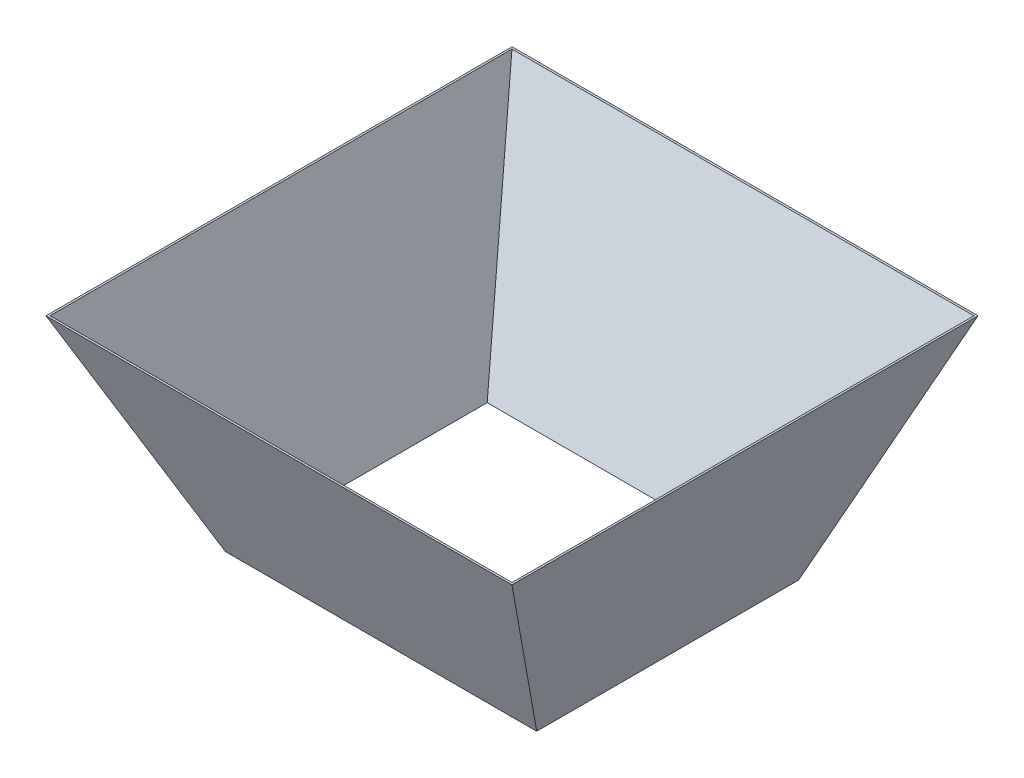
ISO-10303-21;
HEADER;
FILE_DESCRIPTION(('STEP AP214'),'2;1');
FILE_NAME('part.step','',(''),(''),'','','');
FILE_SCHEMA(('AUTOMOTIVE_DESIGN { 1 0 10303 214 1 1 1 1 }'));
ENDSEC;
DATA;
#1=APPLICATION_CONTEXT('core data for automotive mechanical design processes');
#2=APPLICATION_PROTOCOL_DEFINITION('international standard','automotive_design',2000,#1);
#3=PRODUCT_CONTEXT('',#1,'mechanical');
#4=PRODUCT('Part','Part','',(#3));
#5=PRODUCT_RELATED_PRODUCT_CATEGORY('part','',(#4));
#6=PRODUCT_DEFINITION_FORMATION('','',#4);
#7=PRODUCT_DEFINITION_CONTEXT('part definition',#1,'design');
#8=PRODUCT_DEFINITION('design','',#6,#7);
#9=PRODUCT_DEFINITION_SHAPE('','',#8);
#10=(LENGTH_UNIT() NAMED_UNIT(*) SI_UNIT(.MILLI.,.METRE.));
#11=(NAMED_UNIT(*) PLANE_ANGLE_UNIT() SI_UNIT($,.RADIAN.));
#12=(NAMED_UNIT(*) SI_UNIT($,.STERADIAN.) SOLID_ANGLE_UNIT());
#13=UNCERTAINTY_MEASURE_WITH_UNIT(LENGTH_MEASURE(1.E-05),#10,'distance_accuracy_value','');
#14=(GEOMETRIC_REPRESENTATION_CONTEXT(3) GLOBAL_UNCERTAINTY_ASSIGNED_CONTEXT((#13)) GLOBAL_UNIT_ASSIGNED_CONTEXT((#10,
#11,#12)) REPRESENTATION_CONTEXT('',''));
#15=CARTESIAN_POINT('',(0.,0.,0.));
#16=DIRECTION('',(0.,0.,1.));
#17=DIRECTION('',(1.,0.,0.));
#18=AXIS2_PLACEMENT_3D('',#15,#16,#17);
#19=CARTESIAN_POINT('',(0.,0.,0.));
#20=DIRECTION('',(0.,1.,0.));
#21=DIRECTION('',(0.,0.,1.));
#22=AXIS2_PLACEMENT_3D('',#19,#20,#21);
#23=PLANE('',#22);
#24=DIRECTION('',(0.,0.,-1.));
#25=VECTOR('',#24,1.);
#26=CARTESIAN_POINT('',(251.59279308007,0.,0.));
#27=LINE('',#26,#25);
#28=CARTESIAN_POINT('',(251.59279308007,0.,211.658327778338));
#29=VERTEX_POINT('',#28);
#30=CARTESIAN_POINT('',(251.59279308007,0.,-211.658327778338));
#31=VERTEX_POINT('',#30);
#32=EDGE_CURVE('E115',#29,#31,#27,.T.);
#33=ORIENTED_EDGE('',*,*,#32,.F.);
#34=DIRECTION('',(1.,0.,0.));
#35=VECTOR('',#34,1.);
#36=CARTESIAN_POINT('',(0.,0.,211.658327778338));
#37=LINE('',#36,#35);
#38=CARTESIAN_POINT('',(-251.59279308007,0.,211.658327778338));
#39=VERTEX_POINT('',#38);
#40=EDGE_CURVE('E106',#39,#29,#37,.T.);
#41=ORIENTED_EDGE('',*,*,#40,.F.);
#42=DIRECTION('',(0.,0.,1.));
#43=VECTOR('',#42,1.);
#44=CARTESIAN_POINT('',(-251.59279308007,0.,0.));
#45=LINE('',#44,#43);
#46=CARTESIAN_POINT('',(-251.59279308007,0.,-211.658327778338));
#47=VERTEX_POINT('',#46);
#48=EDGE_CURVE('E55',#47,#39,#45,.T.);
#49=ORIENTED_EDGE('',*,*,#48,.F.);
#50=DIRECTION('',(-1.,0.,0.));
#51=VECTOR('',#50,1.);
#52=CARTESIAN_POINT('',(0.,0.,-211.658327778338));
#53=LINE('',#52,#51);
#54=EDGE_CURVE('E12',#31,#47,#53,.T.);
#55=ORIENTED_EDGE('',*,*,#54,.F.);
#56=EDGE_LOOP('',(#33,#41,#49,#55));
#57=FACE_BOUND('',#56,.T.);
#58=DIRECTION('',(1.,0.,0.));
#59=VECTOR('',#58,1.);
#60=CARTESIAN_POINT('',(0.,0.,208.341672221662));
#61=LINE('',#60,#59);
#62=CARTESIAN_POINT('',(-248.40720691993,0.,208.341672221662));
#63=VERTEX_POINT('',#62);
#64=CARTESIAN_POINT('',(248.40720691993,0.,208.341672221662));
#65=VERTEX_POINT('',#64);
#66=EDGE_CURVE('E152',#63,#65,#61,.T.);
#67=ORIENTED_EDGE('',*,*,#66,.T.);
#68=DIRECTION('',(0.,0.,-1.));
#69=VECTOR('',#68,1.);
#70=CARTESIAN_POINT('',(248.40720691993,0.,0.));
#71=LINE('',#70,#69);
#72=CARTESIAN_POINT('',(248.40720691993,0.,-208.341672221662));
#73=VERTEX_POINT('',#72);
#74=EDGE_CURVE('E155',#65,#73,#71,.T.);
#75=ORIENTED_EDGE('',*,*,#74,.T.);
#76=DIRECTION('',(-1.,0.,0.));
#77=VECTOR('',#76,1.);
#78=CARTESIAN_POINT('',(0.,0.,-208.341672221662));
#79=LINE('',#78,#77);
#80=CARTESIAN_POINT('',(-248.40720691993,0.,-208.341672221662));
#81=VERTEX_POINT('',#80);
#82=EDGE_CURVE('E122',#73,#81,#79,.T.);
#83=ORIENTED_EDGE('',*,*,#82,.T.);
#84=DIRECTION('',(0.,0.,1.));
#85=VECTOR('',#84,1.);
#86=CARTESIAN_POINT('',(-248.40720691993,0.,0.));
#87=LINE('',#86,#85);
#88=EDGE_CURVE('E90',#81,#63,#87,.T.);
#89=ORIENTED_EDGE('',*,*,#88,.T.);
#90=EDGE_LOOP('',(#67,#75,#83,#89));
#91=FACE_BOUND('',#90,.T.);
#92=ADVANCED_FACE('F45',(#57,#91),#23,.F.);
#93=CARTESIAN_POINT('',(0.,350.,0.));
#94=DIRECTION('',(0.,1.,0.));
#95=DIRECTION('',(0.,0.,1.));
#96=AXIS2_PLACEMENT_3D('',#93,#94,#95);
#97=PLANE('',#96);
#98=DIRECTION('',(0.,0.,-1.));
#99=VECTOR('',#98,1.);
#100=CARTESIAN_POINT('',(376.59279308007,350.,0.));
#101=LINE('',#100,#99);
#102=CARTESIAN_POINT('',(376.59279308007,350.,376.658327778338));
#103=VERTEX_POINT('',#102);
#104=CARTESIAN_POINT('',(376.59279308007,350.,-376.658327778338));
#105=VERTEX_POINT('',#104);
#106=EDGE_CURVE('E119',#103,#105,#101,.T.);
#107=ORIENTED_EDGE('',*,*,#106,.T.);
#108=DIRECTION('',(-1.,0.,0.));
#109=VECTOR('',#108,1.);
#110=CARTESIAN_POINT('',(0.,350.,-376.658327778338));
#111=LINE('',#110,#109);
#112=CARTESIAN_POINT('',(-376.59279308007,350.,-376.658327778338));
#113=VERTEX_POINT('',#112);
#114=EDGE_CURVE('E123',#105,#113,#111,.T.);
#115=ORIENTED_EDGE('',*,*,#114,.T.);
#116=DIRECTION('',(0.,0.,1.));
#117=VECTOR('',#116,1.);
#118=CARTESIAN_POINT('',(-376.59279308007,350.,0.));
#119=LINE('',#118,#117);
#120=CARTESIAN_POINT('',(-376.59279308007,350.,376.658327778338));
#121=VERTEX_POINT('',#120);
#122=EDGE_CURVE('E81',#113,#121,#119,.T.);
#123=ORIENTED_EDGE('',*,*,#122,.T.);
#124=DIRECTION('',(1.,0.,0.));
#125=VECTOR('',#124,1.);
#126=CARTESIAN_POINT('',(0.,350.,376.658327778338));
#127=LINE('',#126,#125);
#128=EDGE_CURVE('E49',#121,#103,#127,.T.);
#129=ORIENTED_EDGE('',*,*,#128,.T.);
#130=EDGE_LOOP('',(#107,#115,#123,#129));
#131=FACE_BOUND('',#130,.T.);
#132=DIRECTION('',(0.,0.,-1.));
#133=VECTOR('',#132,1.);
#134=CARTESIAN_POINT('',(373.40720691993,350.,0.));
#135=LINE('',#134,#133);
#136=CARTESIAN_POINT('',(373.40720691993,350.,373.341672221662));
#137=VERTEX_POINT('',#136);
#138=CARTESIAN_POINT('',(373.40720691993,350.,-373.341672221662));
#139=VERTEX_POINT('',#138);
#140=EDGE_CURVE('E140',#137,#139,#135,.T.);
#141=ORIENTED_EDGE('',*,*,#140,.F.);
#142=DIRECTION('',(1.,0.,0.));
#143=VECTOR('',#142,1.);
#144=CARTESIAN_POINT('',(0.,350.,373.341672221662));
#145=LINE('',#144,#143);
#146=CARTESIAN_POINT('',(-373.40720691993,350.,373.341672221662));
#147=VERTEX_POINT('',#146);
#148=EDGE_CURVE('E135',#147,#137,#145,.T.);
#149=ORIENTED_EDGE('',*,*,#148,.F.);
#150=DIRECTION('',(0.,0.,1.));
#151=VECTOR('',#150,1.);
#152=CARTESIAN_POINT('',(-373.40720691993,350.,0.));
#153=LINE('',#152,#151);
#154=CARTESIAN_POINT('',(-373.40720691993,350.,-373.341672221662));
#155=VERTEX_POINT('',#154);
#156=EDGE_CURVE('E139',#155,#147,#153,.T.);
#157=ORIENTED_EDGE('',*,*,#156,.F.);
#158=DIRECTION('',(-1.,0.,0.));
#159=VECTOR('',#158,1.);
#160=CARTESIAN_POINT('',(0.,350.,-373.341672221662));
#161=LINE('',#160,#159);
#162=EDGE_CURVE('E143',#139,#155,#161,.T.);
#163=ORIENTED_EDGE('',*,*,#162,.F.);
#164=EDGE_LOOP('',(#141,#149,#157,#163));
#165=FACE_BOUND('',#164,.T.);
#166=ADVANCED_FACE('F126',(#131,#165),#97,.T.);
#167=CARTESIAN_POINT('',(223.132069880967,-79.6900249574882,0.));
#168=DIRECTION('',(0.941741911594837,-0.336336396998157,0.));
#169=DIRECTION('',(0.336336396998157,0.941741911594837,0.));
#170=AXIS2_PLACEMENT_3D('',#167,#168,#169);
#171=PLANE('',#170);
#172=DIRECTION('',(-0.307402866818075,-0.860728027090609,-0.405771784199859));
#173=VECTOR('',#172,1.);
#174=CARTESIAN_POINT('',(201.416860801241,-140.49261038072,145.426097170284));
#175=LINE('',#174,#173);
#176=EDGE_CURVE('E124',#103,#29,#175,.T.);
#177=ORIENTED_EDGE('',*,*,#176,.T.);
#178=ORIENTED_EDGE('',*,*,#32,.T.);
#179=DIRECTION('',(-0.307402866818075,-0.860728027090609,0.405771784199859));
#180=VECTOR('',#179,1.);
#181=CARTESIAN_POINT('',(201.416860801241,-140.49261038072,-145.426097170284));
#182=LINE('',#181,#180);
#183=EDGE_CURVE('E112',#105,#31,#182,.T.);
#184=ORIENTED_EDGE('',*,*,#183,.F.);
#185=ORIENTED_EDGE('',*,*,#106,.F.);
#186=EDGE_LOOP('',(#177,#178,#184,#185));
#187=FACE_BOUND('',#186,.T.);
#188=ADVANCED_FACE('F129',(#187),#171,.T.);
#189=CARTESIAN_POINT('',(0.,-81.6381260924964,-173.171782620447));
#190=DIRECTION('',(0.,-0.426419231698256,-0.9045256429963));
#191=DIRECTION('',(0.,0.9045256429963,-0.426419231698256));
#192=AXIS2_PLACEMENT_3D('',#189,#190,#191);
#193=PLANE('',#192);
#194=ORIENTED_EDGE('',*,*,#183,.T.);
#195=ORIENTED_EDGE('',*,*,#54,.T.);
#196=DIRECTION('',(0.307402866818074,-0.860728027090609,0.405771784199859));
#197=VECTOR('',#196,1.);
#198=CARTESIAN_POINT('',(-201.416860801241,-140.49261038072,-145.426097170284));
#199=LINE('',#198,#197);
#200=EDGE_CURVE('E104',#113,#47,#199,.T.);
#201=ORIENTED_EDGE('',*,*,#200,.F.);
#202=ORIENTED_EDGE('',*,*,#114,.F.);
#203=EDGE_LOOP('',(#194,#195,#201,#202));
#204=FACE_BOUND('',#203,.T.);
#205=ADVANCED_FACE('F198',(#204),#193,.T.);
#206=CARTESIAN_POINT('',(0.,-81.6381260924965,173.171782620447));
#207=DIRECTION('',(0.,-0.426419231698256,0.9045256429963));
#208=DIRECTION('',(0.,-0.9045256429963,-0.426419231698256));
#209=AXIS2_PLACEMENT_3D('',#206,#207,#208);
#210=PLANE('',#209);
#211=DIRECTION('',(0.307402866818074,-0.860728027090609,-0.405771784199859));
#212=VECTOR('',#211,1.);
#213=CARTESIAN_POINT('',(-201.416860801241,-140.49261038072,145.426097170284));
#214=LINE('',#213,#212);
#215=EDGE_CURVE('E102',#121,#39,#214,.T.);
#216=ORIENTED_EDGE('',*,*,#215,.T.);
#217=ORIENTED_EDGE('',*,*,#40,.T.);
#218=ORIENTED_EDGE('',*,*,#176,.F.);
#219=ORIENTED_EDGE('',*,*,#128,.F.);
#220=EDGE_LOOP('',(#216,#217,#218,#219));
#221=FACE_BOUND('',#220,.T.);
#222=ADVANCED_FACE('F109',(#221),#210,.T.);
#223=CARTESIAN_POINT('',(-223.132069880967,-79.6900249574881,0.));
#224=DIRECTION('',(-0.941741911594838,-0.336336396998156,0.));
#225=DIRECTION('',(0.336336396998156,-0.941741911594838,0.));
#226=AXIS2_PLACEMENT_3D('',#223,#224,#225);
#227=PLANE('',#226);
#228=ORIENTED_EDGE('',*,*,#200,.T.);
#229=ORIENTED_EDGE('',*,*,#48,.T.);
#230=ORIENTED_EDGE('',*,*,#215,.F.);
#231=ORIENTED_EDGE('',*,*,#122,.F.);
#232=EDGE_LOOP('',(#228,#229,#230,#231));
#233=FACE_BOUND('',#232,.T.);
#234=ADVANCED_FACE('F47',(#233),#227,.T.);
#235=CARTESIAN_POINT('',(220.306844146182,-78.6810157664938,0.));
#236=DIRECTION('',(0.941741911594837,-0.336336396998157,0.));
#237=DIRECTION('',(0.336336396998157,0.941741911594837,0.));
#238=AXIS2_PLACEMENT_3D('',#235,#236,#237);
#239=PLANE('',#238);
#240=DIRECTION('',(-0.307402866818075,-0.860728027090609,-0.405771784199859));
#241=VECTOR('',#240,1.);
#242=CARTESIAN_POINT('',(198.946005845266,-138.491363009059,143.052886803105));
#243=LINE('',#242,#241);
#244=EDGE_CURVE('E146',#137,#65,#243,.T.);
#245=ORIENTED_EDGE('',*,*,#244,.F.);
#246=ORIENTED_EDGE('',*,*,#140,.T.);
#247=DIRECTION('',(-0.307402866818075,-0.860728027090609,0.405771784199859));
#248=VECTOR('',#247,1.);
#249=CARTESIAN_POINT('',(198.946005845266,-138.491363009059,-143.052886803105));
#250=LINE('',#249,#248);
#251=EDGE_CURVE('E161',#139,#73,#250,.T.);
#252=ORIENTED_EDGE('',*,*,#251,.T.);
#253=ORIENTED_EDGE('',*,*,#74,.F.);
#254=EDGE_LOOP('',(#245,#246,#252,#253));
#255=FACE_BOUND('',#254,.T.);
#256=ADVANCED_FACE('F179',(#255),#239,.F.);
#257=CARTESIAN_POINT('',(0.,-80.3588683974017,-170.458205691458));
#258=DIRECTION('',(0.,-0.426419231698256,-0.9045256429963));
#259=DIRECTION('',(0.,0.9045256429963,-0.426419231698256));
#260=AXIS2_PLACEMENT_3D('',#257,#258,#259);
#261=PLANE('',#260);
#262=ORIENTED_EDGE('',*,*,#251,.F.);
#263=ORIENTED_EDGE('',*,*,#162,.T.);
#264=DIRECTION('',(0.307402866818074,-0.860728027090609,0.405771784199859));
#265=VECTOR('',#264,1.);
#266=CARTESIAN_POINT('',(-198.946005845266,-138.491363009059,-143.052886803105));
#267=LINE('',#266,#265);
#268=EDGE_CURVE('E158',#155,#81,#267,.T.);
#269=ORIENTED_EDGE('',*,*,#268,.T.);
#270=ORIENTED_EDGE('',*,*,#82,.F.);
#271=EDGE_LOOP('',(#262,#263,#269,#270));
#272=FACE_BOUND('',#271,.T.);
#273=ADVANCED_FACE('F189',(#272),#261,.F.);
#274=CARTESIAN_POINT('',(0.,-80.3588683974017,170.458205691458));
#275=DIRECTION('',(0.,-0.426419231698256,0.9045256429963));
#276=DIRECTION('',(0.,-0.9045256429963,-0.426419231698256));
#277=AXIS2_PLACEMENT_3D('',#274,#275,#276);
#278=PLANE('',#277);
#279=DIRECTION('',(0.307402866818074,-0.860728027090609,-0.405771784199859));
#280=VECTOR('',#279,1.);
#281=CARTESIAN_POINT('',(-198.946005845266,-138.491363009059,143.052886803105));
#282=LINE('',#281,#280);
#283=EDGE_CURVE('E159',#147,#63,#282,.T.);
#284=ORIENTED_EDGE('',*,*,#283,.F.);
#285=ORIENTED_EDGE('',*,*,#148,.T.);
#286=ORIENTED_EDGE('',*,*,#244,.T.);
#287=ORIENTED_EDGE('',*,*,#66,.F.);
#288=EDGE_LOOP('',(#284,#285,#286,#287));
#289=FACE_BOUND('',#288,.T.);
#290=ADVANCED_FACE('F171',(#289),#278,.F.);
#291=CARTESIAN_POINT('',(-220.306844146183,-78.6810157664937,0.));
#292=DIRECTION('',(-0.941741911594838,-0.336336396998156,0.));
#293=DIRECTION('',(0.336336396998156,-0.941741911594838,0.));
#294=AXIS2_PLACEMENT_3D('',#291,#292,#293);
#295=PLANE('',#294);
#296=ORIENTED_EDGE('',*,*,#268,.F.);
#297=ORIENTED_EDGE('',*,*,#156,.T.);
#298=ORIENTED_EDGE('',*,*,#283,.T.);
#299=ORIENTED_EDGE('',*,*,#88,.F.);
#300=EDGE_LOOP('',(#296,#297,#298,#299));
#301=FACE_BOUND('',#300,.T.);
#302=ADVANCED_FACE('F191',(#301),#295,.F.);
#303=CLOSED_SHELL('',(#92,#166,#188,#205,#222,#234,#256,#273,#290,#302));
#304=MANIFOLD_SOLID_BREP('B2',#303);
#305=ADVANCED_BREP_SHAPE_REPRESENTATION('',(#18,#304),#14);
#306=SHAPE_DEFINITION_REPRESENTATION(#9,#305);
ENDSEC;
END-ISO-10303-21;
